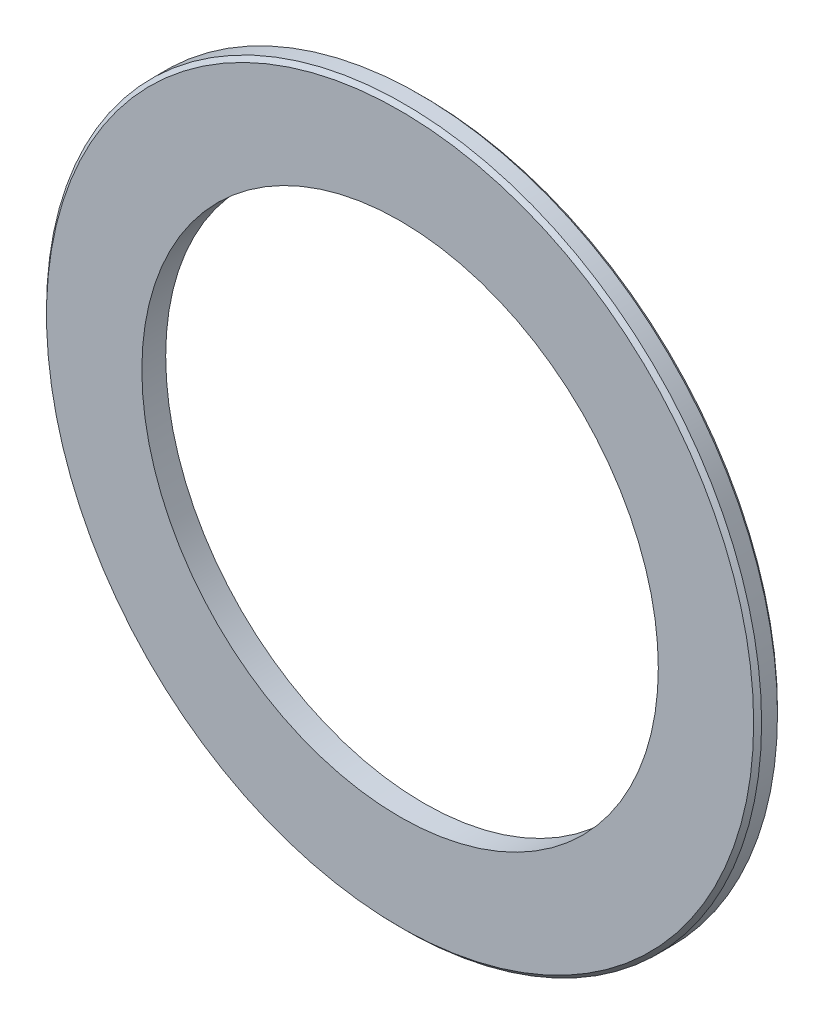
ISO-10303-21;
HEADER;
FILE_DESCRIPTION(('STEP AP214'),'2;1');
FILE_NAME('part.step','',(''),(''),'','','');
FILE_SCHEMA(('AUTOMOTIVE_DESIGN { 1 0 10303 214 1 1 1 1 }'));
ENDSEC;
DATA;
#1=APPLICATION_CONTEXT('core data for automotive mechanical design processes');
#2=APPLICATION_PROTOCOL_DEFINITION('international standard','automotive_design',2000,#1);
#3=PRODUCT_CONTEXT('',#1,'mechanical');
#4=PRODUCT('Part','Part','',(#3));
#5=PRODUCT_RELATED_PRODUCT_CATEGORY('part','',(#4));
#6=PRODUCT_DEFINITION_FORMATION('','',#4);
#7=PRODUCT_DEFINITION_CONTEXT('part definition',#1,'design');
#8=PRODUCT_DEFINITION('design','',#6,#7);
#9=PRODUCT_DEFINITION_SHAPE('','',#8);
#10=(LENGTH_UNIT() NAMED_UNIT(*) SI_UNIT(.MILLI.,.METRE.));
#11=(NAMED_UNIT(*) PLANE_ANGLE_UNIT() SI_UNIT($,.RADIAN.));
#12=(NAMED_UNIT(*) SI_UNIT($,.STERADIAN.) SOLID_ANGLE_UNIT());
#13=UNCERTAINTY_MEASURE_WITH_UNIT(LENGTH_MEASURE(1.E-05),#10,'distance_accuracy_value','');
#14=(GEOMETRIC_REPRESENTATION_CONTEXT(3) GLOBAL_UNCERTAINTY_ASSIGNED_CONTEXT((#13)) GLOBAL_UNIT_ASSIGNED_CONTEXT((#10,
#11,#12)) REPRESENTATION_CONTEXT('',''));
#15=CARTESIAN_POINT('',(0.,0.,0.));
#16=DIRECTION('',(0.,0.,1.));
#17=DIRECTION('',(1.,0.,0.));
#18=AXIS2_PLACEMENT_3D('',#15,#16,#17);
#19=CARTESIAN_POINT('',(0.,0.,3.));
#20=DIRECTION('',(0.,0.,1.));
#21=DIRECTION('',(1.,0.,0.));
#22=AXIS2_PLACEMENT_3D('',#19,#20,#21);
#23=PLANE('',#22);
#24=CARTESIAN_POINT('',(0.,0.,3.));
#25=DIRECTION('',(0.,0.,1.));
#26=DIRECTION('',(1.,0.,0.));
#27=AXIS2_PLACEMENT_3D('',#24,#25,#26);
#28=CIRCLE('',#27,44.5);
#29=CARTESIAN_POINT('',(44.5,0.,3.));
#30=VERTEX_POINT('',#29);
#31=EDGE_CURVE('E10',#30,#30,#28,.T.);
#32=ORIENTED_EDGE('',*,*,#31,.T.);
#33=EDGE_LOOP('',(#32));
#34=FACE_BOUND('',#33,.T.);
#35=CARTESIAN_POINT('',(0.,0.,3.));
#36=DIRECTION('',(0.,0.,1.));
#37=DIRECTION('',(1.,0.,0.));
#38=AXIS2_PLACEMENT_3D('',#35,#36,#37);
#39=CIRCLE('',#38,32.5);
#40=CARTESIAN_POINT('',(32.5,0.,3.));
#41=VERTEX_POINT('',#40);
#42=EDGE_CURVE('E62',#41,#41,#39,.T.);
#43=ORIENTED_EDGE('',*,*,#42,.F.);
#44=EDGE_LOOP('',(#43));
#45=FACE_BOUND('',#44,.T.);
#46=ADVANCED_FACE('F41',(#34,#45),#23,.T.);
#47=CARTESIAN_POINT('',(0.,0.,0.));
#48=DIRECTION('',(0.,0.,1.));
#49=DIRECTION('',(1.,0.,0.));
#50=AXIS2_PLACEMENT_3D('',#47,#48,#49);
#51=PLANE('',#50);
#52=CARTESIAN_POINT('',(0.,0.,0.));
#53=DIRECTION('',(0.,0.,1.));
#54=DIRECTION('',(1.,0.,0.));
#55=AXIS2_PLACEMENT_3D('',#52,#53,#54);
#56=CIRCLE('',#55,44.5);
#57=CARTESIAN_POINT('',(44.5,0.,0.));
#58=VERTEX_POINT('',#57);
#59=EDGE_CURVE('E49',#58,#58,#56,.F.);
#60=ORIENTED_EDGE('',*,*,#59,.T.);
#61=EDGE_LOOP('',(#60));
#62=FACE_BOUND('',#61,.T.);
#63=CARTESIAN_POINT('',(0.,0.,0.));
#64=DIRECTION('',(0.,0.,1.));
#65=DIRECTION('',(1.,0.,0.));
#66=AXIS2_PLACEMENT_3D('',#63,#64,#65);
#67=CIRCLE('',#66,32.5);
#68=CARTESIAN_POINT('',(32.5,0.,0.));
#69=VERTEX_POINT('',#68);
#70=EDGE_CURVE('E63',#69,#69,#67,.T.);
#71=ORIENTED_EDGE('',*,*,#70,.T.);
#72=EDGE_LOOP('',(#71));
#73=FACE_BOUND('',#72,.T.);
#74=ADVANCED_FACE('F73',(#62,#73),#51,.F.);
#75=CARTESIAN_POINT('',(0.,0.,3.));
#76=DIRECTION('',(0.,0.,-1.));
#77=DIRECTION('',(-1.,0.,0.));
#78=AXIS2_PLACEMENT_3D('',#75,#76,#77);
#79=CYLINDRICAL_SURFACE('',#78,45.);
#80=CARTESIAN_POINT('',(0.,0.,0.500000000000007));
#81=DIRECTION('',(0.,0.,1.));
#82=DIRECTION('',(1.,0.,0.));
#83=AXIS2_PLACEMENT_3D('',#80,#81,#82);
#84=CIRCLE('',#83,45.);
#85=CARTESIAN_POINT('',(45.,0.,0.500000000000007));
#86=VERTEX_POINT('',#85);
#87=EDGE_CURVE('E53',#86,#86,#84,.T.);
#88=ORIENTED_EDGE('',*,*,#87,.T.);
#89=EDGE_LOOP('',(#88));
#90=FACE_BOUND('',#89,.T.);
#91=CARTESIAN_POINT('',(0.,0.,2.49999999999996));
#92=DIRECTION('',(0.,0.,1.));
#93=DIRECTION('',(1.,0.,0.));
#94=AXIS2_PLACEMENT_3D('',#91,#92,#93);
#95=CIRCLE('',#94,45.);
#96=CARTESIAN_POINT('',(45.,0.,2.49999999999996));
#97=VERTEX_POINT('',#96);
#98=EDGE_CURVE('E57',#97,#97,#95,.F.);
#99=ORIENTED_EDGE('',*,*,#98,.T.);
#100=EDGE_LOOP('',(#99));
#101=FACE_BOUND('',#100,.T.);
#102=ADVANCED_FACE('F79',(#90,#101),#79,.T.);
#103=CARTESIAN_POINT('',(0.,0.,3.));
#104=DIRECTION('',(0.,0.,-1.));
#105=DIRECTION('',(-1.,0.,0.));
#106=AXIS2_PLACEMENT_3D('',#103,#104,#105);
#107=CYLINDRICAL_SURFACE('',#106,32.5);
#108=ORIENTED_EDGE('',*,*,#42,.T.);
#109=EDGE_LOOP('',(#108));
#110=FACE_BOUND('',#109,.T.);
#111=ORIENTED_EDGE('',*,*,#70,.F.);
#112=EDGE_LOOP('',(#111));
#113=FACE_BOUND('',#112,.T.);
#114=ADVANCED_FACE('F69',(#110,#113),#107,.F.);
#115=CARTESIAN_POINT('',(0.,0.,0.500000000000007));
#116=DIRECTION('',(0.,0.,1.));
#117=DIRECTION('',(1.,0.,0.));
#118=AXIS2_PLACEMENT_3D('',#115,#116,#117);
#119=CONICAL_SURFACE('',#118,45.,0.785398163397455);
#120=ORIENTED_EDGE('',*,*,#59,.F.);
#121=EDGE_LOOP('',(#120));
#122=FACE_BOUND('',#121,.T.);
#123=ORIENTED_EDGE('',*,*,#87,.F.);
#124=EDGE_LOOP('',(#123));
#125=FACE_BOUND('',#124,.T.);
#126=ADVANCED_FACE('F86',(#122,#125),#119,.T.);
#127=CARTESIAN_POINT('',(0.,0.,3.));
#128=DIRECTION('',(0.,0.,-1.));
#129=DIRECTION('',(-1.,0.,0.));
#130=AXIS2_PLACEMENT_3D('',#127,#128,#129);
#131=CONICAL_SURFACE('',#130,44.5,0.785398163397448);
#132=ORIENTED_EDGE('',*,*,#98,.F.);
#133=EDGE_LOOP('',(#132));
#134=FACE_BOUND('',#133,.T.);
#135=ORIENTED_EDGE('',*,*,#31,.F.);
#136=EDGE_LOOP('',(#135));
#137=FACE_BOUND('',#136,.T.);
#138=ADVANCED_FACE('F44',(#134,#137),#131,.T.);
#139=CLOSED_SHELL('',(#46,#74,#102,#114,#126,#138));
#140=MANIFOLD_SOLID_BREP('B2',#139);
#141=ADVANCED_BREP_SHAPE_REPRESENTATION('',(#18,#140),#14);
#142=SHAPE_DEFINITION_REPRESENTATION(#9,#141);
ENDSEC;
END-ISO-10303-21;
